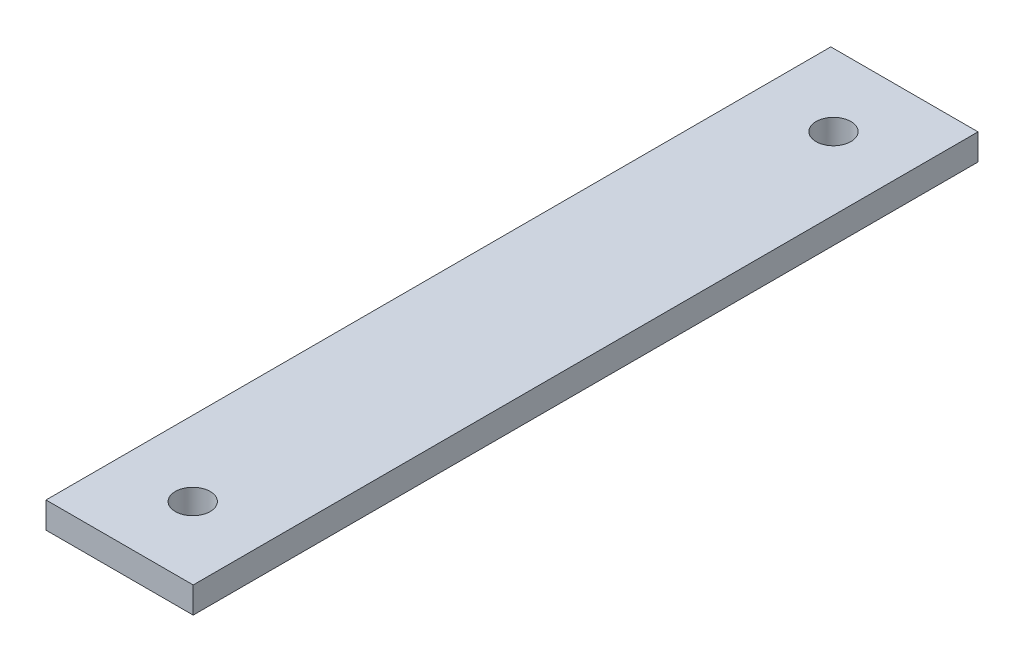
ISO-10303-21;
HEADER;
FILE_DESCRIPTION(('STEP AP214'),'2;1');
FILE_NAME('part.step','',(''),(''),'','','');
FILE_SCHEMA(('AUTOMOTIVE_DESIGN { 1 0 10303 214 1 1 1 1 }'));
ENDSEC;
DATA;
#1=APPLICATION_CONTEXT('core data for automotive mechanical design processes');
#2=APPLICATION_PROTOCOL_DEFINITION('international standard','automotive_design',2000,#1);
#3=PRODUCT_CONTEXT('',#1,'mechanical');
#4=PRODUCT('Part','Part','',(#3));
#5=PRODUCT_RELATED_PRODUCT_CATEGORY('part','',(#4));
#6=PRODUCT_DEFINITION_FORMATION('','',#4);
#7=PRODUCT_DEFINITION_CONTEXT('part definition',#1,'design');
#8=PRODUCT_DEFINITION('design','',#6,#7);
#9=PRODUCT_DEFINITION_SHAPE('','',#8);
#10=(LENGTH_UNIT() NAMED_UNIT(*) SI_UNIT(.MILLI.,.METRE.));
#11=(NAMED_UNIT(*) PLANE_ANGLE_UNIT() SI_UNIT($,.RADIAN.));
#12=(NAMED_UNIT(*) SI_UNIT($,.STERADIAN.) SOLID_ANGLE_UNIT());
#13=UNCERTAINTY_MEASURE_WITH_UNIT(LENGTH_MEASURE(1.E-05),#10,'distance_accuracy_value','');
#14=(GEOMETRIC_REPRESENTATION_CONTEXT(3) GLOBAL_UNCERTAINTY_ASSIGNED_CONTEXT((#13)) GLOBAL_UNIT_ASSIGNED_CONTEXT((#10,
#11,#12)) REPRESENTATION_CONTEXT('',''));
#15=CARTESIAN_POINT('',(0.,0.,0.));
#16=DIRECTION('',(0.,0.,1.));
#17=DIRECTION('',(1.,0.,0.));
#18=AXIS2_PLACEMENT_3D('',#15,#16,#17);
#19=CARTESIAN_POINT('',(4.22,1.5,22.5));
#20=DIRECTION('',(-1.,0.,0.));
#21=DIRECTION('',(0.,0.,1.));
#22=AXIS2_PLACEMENT_3D('',#19,#20,#21);
#23=PLANE('',#22);
#24=DIRECTION('',(0.,0.,-1.));
#25=VECTOR('',#24,1.);
#26=CARTESIAN_POINT('',(4.22,0.,22.5));
#27=LINE('',#26,#25);
#28=CARTESIAN_POINT('',(4.22,0.,22.5));
#29=VERTEX_POINT('',#28);
#30=CARTESIAN_POINT('',(4.22,0.,-22.5));
#31=VERTEX_POINT('',#30);
#32=EDGE_CURVE('E111',#29,#31,#27,.T.);
#33=ORIENTED_EDGE('',*,*,#32,.T.);
#34=DIRECTION('',(0.,-1.,0.));
#35=VECTOR('',#34,1.);
#36=CARTESIAN_POINT('',(4.22,1.5,-22.5));
#37=LINE('',#36,#35);
#38=CARTESIAN_POINT('',(4.22,1.5,-22.5));
#39=VERTEX_POINT('',#38);
#40=EDGE_CURVE('E11',#39,#31,#37,.T.);
#41=ORIENTED_EDGE('',*,*,#40,.F.);
#42=DIRECTION('',(0.,0.,-1.));
#43=VECTOR('',#42,1.);
#44=CARTESIAN_POINT('',(4.22,1.5,22.5));
#45=LINE('',#44,#43);
#46=CARTESIAN_POINT('',(4.22,1.5,22.5));
#47=VERTEX_POINT('',#46);
#48=EDGE_CURVE('E95',#47,#39,#45,.T.);
#49=ORIENTED_EDGE('',*,*,#48,.F.);
#50=DIRECTION('',(0.,-1.,0.));
#51=VECTOR('',#50,1.);
#52=CARTESIAN_POINT('',(4.22,1.5,22.5));
#53=LINE('',#52,#51);
#54=EDGE_CURVE('E107',#47,#29,#53,.T.);
#55=ORIENTED_EDGE('',*,*,#54,.T.);
#56=EDGE_LOOP('',(#33,#41,#49,#55));
#57=FACE_BOUND('',#56,.T.);
#58=ADVANCED_FACE('F43',(#57),#23,.F.);
#59=CARTESIAN_POINT('',(-4.22,1.5,-22.5));
#60=DIRECTION('',(0.,0.,1.));
#61=DIRECTION('',(1.,0.,0.));
#62=AXIS2_PLACEMENT_3D('',#59,#60,#61);
#63=PLANE('',#62);
#64=DIRECTION('',(-1.,0.,0.));
#65=VECTOR('',#64,1.);
#66=CARTESIAN_POINT('',(-4.22,0.,-22.5));
#67=LINE('',#66,#65);
#68=CARTESIAN_POINT('',(-4.22,0.,-22.5));
#69=VERTEX_POINT('',#68);
#70=EDGE_CURVE('E100',#31,#69,#67,.T.);
#71=ORIENTED_EDGE('',*,*,#70,.T.);
#72=DIRECTION('',(0.,-1.,0.));
#73=VECTOR('',#72,1.);
#74=CARTESIAN_POINT('',(-4.22,1.5,-22.5));
#75=LINE('',#74,#73);
#76=CARTESIAN_POINT('',(-4.22,1.5,-22.5));
#77=VERTEX_POINT('',#76);
#78=EDGE_CURVE('E52',#77,#69,#75,.T.);
#79=ORIENTED_EDGE('',*,*,#78,.F.);
#80=DIRECTION('',(-1.,0.,0.));
#81=VECTOR('',#80,1.);
#82=CARTESIAN_POINT('',(-4.22,1.5,-22.5));
#83=LINE('',#82,#81);
#84=EDGE_CURVE('E90',#39,#77,#83,.T.);
#85=ORIENTED_EDGE('',*,*,#84,.F.);
#86=ORIENTED_EDGE('',*,*,#40,.T.);
#87=EDGE_LOOP('',(#71,#79,#85,#86));
#88=FACE_BOUND('',#87,.T.);
#89=ADVANCED_FACE('F99',(#88),#63,.F.);
#90=CARTESIAN_POINT('',(-4.22,1.5,22.5));
#91=DIRECTION('',(1.,0.,0.));
#92=DIRECTION('',(0.,0.,-1.));
#93=AXIS2_PLACEMENT_3D('',#90,#91,#92);
#94=PLANE('',#93);
#95=DIRECTION('',(0.,0.,1.));
#96=VECTOR('',#95,1.);
#97=CARTESIAN_POINT('',(-4.22,0.,22.5));
#98=LINE('',#97,#96);
#99=CARTESIAN_POINT('',(-4.22,0.,22.5));
#100=VERTEX_POINT('',#99);
#101=EDGE_CURVE('E77',#69,#100,#98,.T.);
#102=ORIENTED_EDGE('',*,*,#101,.T.);
#103=DIRECTION('',(0.,-1.,0.));
#104=VECTOR('',#103,1.);
#105=CARTESIAN_POINT('',(-4.22,1.5,22.5));
#106=LINE('',#105,#104);
#107=CARTESIAN_POINT('',(-4.22,1.5,22.5));
#108=VERTEX_POINT('',#107);
#109=EDGE_CURVE('E102',#108,#100,#106,.T.);
#110=ORIENTED_EDGE('',*,*,#109,.F.);
#111=DIRECTION('',(0.,0.,1.));
#112=VECTOR('',#111,1.);
#113=CARTESIAN_POINT('',(-4.22,1.5,22.5));
#114=LINE('',#113,#112);
#115=EDGE_CURVE('E93',#77,#108,#114,.T.);
#116=ORIENTED_EDGE('',*,*,#115,.F.);
#117=ORIENTED_EDGE('',*,*,#78,.T.);
#118=EDGE_LOOP('',(#102,#110,#116,#117));
#119=FACE_BOUND('',#118,.T.);
#120=ADVANCED_FACE('F103',(#119),#94,.F.);
#121=CARTESIAN_POINT('',(-4.22,1.5,22.5));
#122=DIRECTION('',(0.,0.,-1.));
#123=DIRECTION('',(-1.,0.,0.));
#124=AXIS2_PLACEMENT_3D('',#121,#122,#123);
#125=PLANE('',#124);
#126=DIRECTION('',(1.,0.,0.));
#127=VECTOR('',#126,1.);
#128=CARTESIAN_POINT('',(-4.22,0.,22.5));
#129=LINE('',#128,#127);
#130=EDGE_CURVE('E83',#100,#29,#129,.T.);
#131=ORIENTED_EDGE('',*,*,#130,.T.);
#132=ORIENTED_EDGE('',*,*,#54,.F.);
#133=DIRECTION('',(1.,0.,0.));
#134=VECTOR('',#133,1.);
#135=CARTESIAN_POINT('',(-4.22,1.5,22.5));
#136=LINE('',#135,#134);
#137=EDGE_CURVE('E60',#108,#47,#136,.T.);
#138=ORIENTED_EDGE('',*,*,#137,.F.);
#139=ORIENTED_EDGE('',*,*,#109,.T.);
#140=EDGE_LOOP('',(#131,#132,#138,#139));
#141=FACE_BOUND('',#140,.T.);
#142=ADVANCED_FACE('F125',(#141),#125,.F.);
#143=CARTESIAN_POINT('',(0.,1.5,0.));
#144=DIRECTION('',(0.,-1.,0.));
#145=DIRECTION('',(0.,0.,-1.));
#146=AXIS2_PLACEMENT_3D('',#143,#144,#145);
#147=PLANE('',#146);
#148=CARTESIAN_POINT('',(0.063328701811749,1.5,-18.37));
#149=DIRECTION('',(0.,1.,0.));
#150=DIRECTION('',(0.,0.,1.));
#151=AXIS2_PLACEMENT_3D('',#148,#149,#150);
#152=CIRCLE('',#151,1.);
#153=CARTESIAN_POINT('',(0.063328701811749,1.5,-17.37));
#154=VERTEX_POINT('',#153);
#155=EDGE_CURVE('E136',#154,#154,#152,.T.);
#156=ORIENTED_EDGE('',*,*,#155,.F.);
#157=EDGE_LOOP('',(#156));
#158=FACE_BOUND('',#157,.T.);
#159=CARTESIAN_POINT('',(0.063328701811749,1.5,18.37));
#160=DIRECTION('',(0.,1.,0.));
#161=DIRECTION('',(0.,0.,-1.));
#162=AXIS2_PLACEMENT_3D('',#159,#160,#161);
#163=CIRCLE('',#162,1.);
#164=CARTESIAN_POINT('',(0.063328701811749,1.5,17.37));
#165=VERTEX_POINT('',#164);
#166=EDGE_CURVE('E132',#165,#165,#163,.T.);
#167=ORIENTED_EDGE('',*,*,#166,.F.);
#168=EDGE_LOOP('',(#167));
#169=FACE_BOUND('',#168,.T.);
#170=ORIENTED_EDGE('',*,*,#48,.T.);
#171=ORIENTED_EDGE('',*,*,#84,.T.);
#172=ORIENTED_EDGE('',*,*,#115,.T.);
#173=ORIENTED_EDGE('',*,*,#137,.T.);
#174=EDGE_LOOP('',(#170,#171,#172,#173));
#175=FACE_BOUND('',#174,.T.);
#176=ADVANCED_FACE('F91',(#158,#169,#175),#147,.F.);
#177=CARTESIAN_POINT('',(0.,0.,0.));
#178=DIRECTION('',(0.,-1.,0.));
#179=DIRECTION('',(0.,0.,-1.));
#180=AXIS2_PLACEMENT_3D('',#177,#178,#179);
#181=PLANE('',#180);
#182=CARTESIAN_POINT('',(0.063328701811749,0.,-18.37));
#183=DIRECTION('',(0.,-1.,0.));
#184=DIRECTION('',(0.,0.,-1.));
#185=AXIS2_PLACEMENT_3D('',#182,#183,#184);
#186=CIRCLE('',#185,1.);
#187=CARTESIAN_POINT('',(0.063328701811749,0.,-19.37));
#188=VERTEX_POINT('',#187);
#189=EDGE_CURVE('E115',#188,#188,#186,.F.);
#190=ORIENTED_EDGE('',*,*,#189,.T.);
#191=EDGE_LOOP('',(#190));
#192=FACE_BOUND('',#191,.T.);
#193=CARTESIAN_POINT('',(0.063328701811749,0.,18.37));
#194=DIRECTION('',(0.,-1.,0.));
#195=DIRECTION('',(0.,0.,-1.));
#196=AXIS2_PLACEMENT_3D('',#193,#194,#195);
#197=CIRCLE('',#196,1.);
#198=CARTESIAN_POINT('',(0.063328701811749,0.,17.37));
#199=VERTEX_POINT('',#198);
#200=EDGE_CURVE('E137',#199,#199,#197,.F.);
#201=ORIENTED_EDGE('',*,*,#200,.T.);
#202=EDGE_LOOP('',(#201));
#203=FACE_BOUND('',#202,.T.);
#204=ORIENTED_EDGE('',*,*,#32,.F.);
#205=ORIENTED_EDGE('',*,*,#130,.F.);
#206=ORIENTED_EDGE('',*,*,#101,.F.);
#207=ORIENTED_EDGE('',*,*,#70,.F.);
#208=EDGE_LOOP('',(#204,#205,#206,#207));
#209=FACE_BOUND('',#208,.T.);
#210=ADVANCED_FACE('F128',(#192,#203,#209),#181,.T.);
#211=CARTESIAN_POINT('',(0.063328701811749,-2.82842712474619,18.37));
#212=DIRECTION('',(0.,1.,0.));
#213=DIRECTION('',(0.,0.,1.));
#214=AXIS2_PLACEMENT_3D('',#211,#212,#213);
#215=CYLINDRICAL_SURFACE('',#214,1.);
#216=ORIENTED_EDGE('',*,*,#166,.T.);
#217=EDGE_LOOP('',(#216));
#218=FACE_BOUND('',#217,.T.);
#219=ORIENTED_EDGE('',*,*,#200,.F.);
#220=EDGE_LOOP('',(#219));
#221=FACE_BOUND('',#220,.T.);
#222=ADVANCED_FACE('F156',(#218,#221),#215,.F.);
#223=CARTESIAN_POINT('',(0.063328701811749,-2.82842712474619,-18.37));
#224=DIRECTION('',(0.,1.,0.));
#225=DIRECTION('',(0.,0.,1.));
#226=AXIS2_PLACEMENT_3D('',#223,#224,#225);
#227=CYLINDRICAL_SURFACE('',#226,1.);
#228=ORIENTED_EDGE('',*,*,#155,.T.);
#229=EDGE_LOOP('',(#228));
#230=FACE_BOUND('',#229,.T.);
#231=ORIENTED_EDGE('',*,*,#189,.F.);
#232=EDGE_LOOP('',(#231));
#233=FACE_BOUND('',#232,.T.);
#234=ADVANCED_FACE('F148',(#230,#233),#227,.F.);
#235=CLOSED_SHELL('',(#58,#89,#120,#142,#176,#210,#222,#234));
#236=MANIFOLD_SOLID_BREP('B2',#235);
#237=ADVANCED_BREP_SHAPE_REPRESENTATION('',(#18,#236),#14);
#238=SHAPE_DEFINITION_REPRESENTATION(#9,#237);
ENDSEC;
END-ISO-10303-21;
